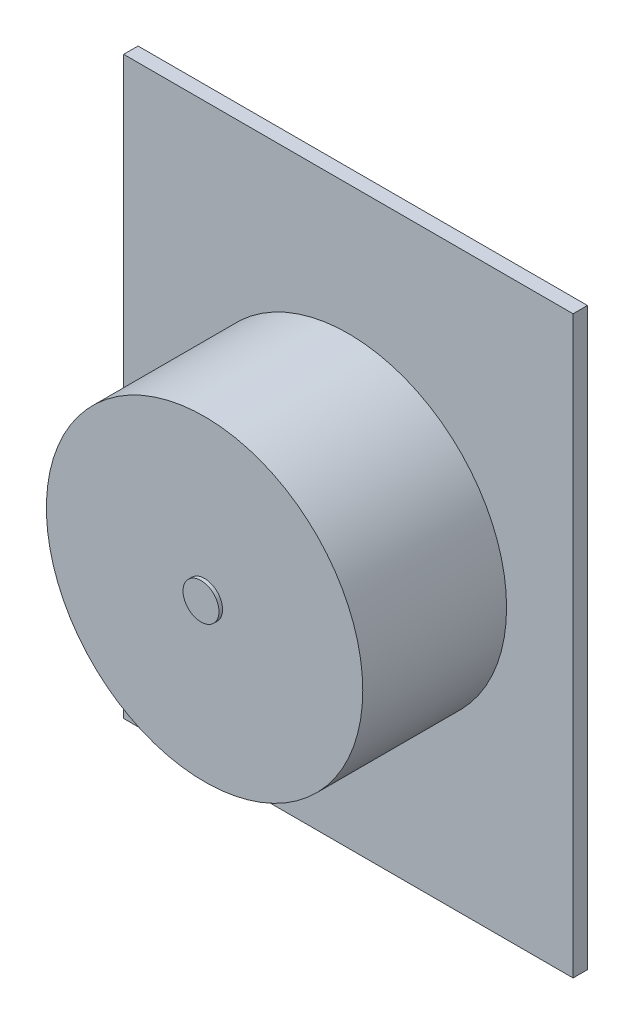
ISO-10303-21;
HEADER;
FILE_DESCRIPTION(('STEP AP214'),'2;1');
FILE_NAME('part.step','',(''),(''),'','','');
FILE_SCHEMA(('AUTOMOTIVE_DESIGN { 1 0 10303 214 1 1 1 1 }'));
ENDSEC;
DATA;
#1=APPLICATION_CONTEXT('core data for automotive mechanical design processes');
#2=APPLICATION_PROTOCOL_DEFINITION('international standard','automotive_design',2000,#1);
#3=PRODUCT_CONTEXT('',#1,'mechanical');
#4=PRODUCT('Part','Part','',(#3));
#5=PRODUCT_RELATED_PRODUCT_CATEGORY('part','',(#4));
#6=PRODUCT_DEFINITION_FORMATION('','',#4);
#7=PRODUCT_DEFINITION_CONTEXT('part definition',#1,'design');
#8=PRODUCT_DEFINITION('design','',#6,#7);
#9=PRODUCT_DEFINITION_SHAPE('','',#8);
#10=(LENGTH_UNIT() NAMED_UNIT(*) SI_UNIT(.MILLI.,.METRE.));
#11=(NAMED_UNIT(*) PLANE_ANGLE_UNIT() SI_UNIT($,.RADIAN.));
#12=(NAMED_UNIT(*) SI_UNIT($,.STERADIAN.) SOLID_ANGLE_UNIT());
#13=UNCERTAINTY_MEASURE_WITH_UNIT(LENGTH_MEASURE(1.E-05),#10,'distance_accuracy_value','');
#14=(GEOMETRIC_REPRESENTATION_CONTEXT(3) GLOBAL_UNCERTAINTY_ASSIGNED_CONTEXT((#13)) GLOBAL_UNIT_ASSIGNED_CONTEXT((#10,
#11,#12)) REPRESENTATION_CONTEXT('',''));
#15=CARTESIAN_POINT('',(0.,0.,0.));
#16=DIRECTION('',(0.,0.,1.));
#17=DIRECTION('',(1.,0.,0.));
#18=AXIS2_PLACEMENT_3D('',#15,#16,#17);
#19=CARTESIAN_POINT('',(0.,0.,40.));
#20=DIRECTION('',(-1.,0.,0.));
#21=DIRECTION('',(0.,-1.,0.));
#22=AXIS2_PLACEMENT_3D('',#19,#20,#21);
#23=PLANE('',#22);
#24=DIRECTION('',(0.,1.,0.));
#25=VECTOR('',#24,1.);
#26=CARTESIAN_POINT('',(0.,0.,0.));
#27=LINE('',#26,#25);
#28=CARTESIAN_POINT('',(0.,0.,0.));
#29=VERTEX_POINT('',#28);
#30=CARTESIAN_POINT('',(0.,1600.,0.));
#31=VERTEX_POINT('',#30);
#32=EDGE_CURVE('E106',#29,#31,#27,.T.);
#33=ORIENTED_EDGE('',*,*,#32,.T.);
#34=DIRECTION('',(0.,0.,-1.));
#35=VECTOR('',#34,1.);
#36=CARTESIAN_POINT('',(0.,1600.,40.));
#37=LINE('',#36,#35);
#38=CARTESIAN_POINT('',(0.,1600.,40.));
#39=VERTEX_POINT('',#38);
#40=EDGE_CURVE('E45',#39,#31,#37,.T.);
#41=ORIENTED_EDGE('',*,*,#40,.F.);
#42=DIRECTION('',(0.,1.,0.));
#43=VECTOR('',#42,1.);
#44=CARTESIAN_POINT('',(0.,0.,40.));
#45=LINE('',#44,#43);
#46=CARTESIAN_POINT('',(0.,0.,40.));
#47=VERTEX_POINT('',#46);
#48=EDGE_CURVE('E91',#47,#39,#45,.T.);
#49=ORIENTED_EDGE('',*,*,#48,.F.);
#50=DIRECTION('',(0.,0.,-1.));
#51=VECTOR('',#50,1.);
#52=CARTESIAN_POINT('',(0.,0.,40.));
#53=LINE('',#52,#51);
#54=EDGE_CURVE('E105',#47,#29,#53,.T.);
#55=ORIENTED_EDGE('',*,*,#54,.T.);
#56=EDGE_LOOP('',(#33,#41,#49,#55));
#57=FACE_BOUND('',#56,.T.);
#58=ADVANCED_FACE('F39',(#57),#23,.F.);
#59=CARTESIAN_POINT('',(0.,1600.,40.));
#60=DIRECTION('',(0.,-1.,0.));
#61=DIRECTION('',(1.,0.,0.));
#62=AXIS2_PLACEMENT_3D('',#59,#60,#61);
#63=PLANE('',#62);
#64=DIRECTION('',(-1.,0.,0.));
#65=VECTOR('',#64,1.);
#66=CARTESIAN_POINT('',(0.,1600.,0.));
#67=LINE('',#66,#65);
#68=CARTESIAN_POINT('',(-1250.,1600.,0.));
#69=VERTEX_POINT('',#68);
#70=EDGE_CURVE('E98',#31,#69,#67,.T.);
#71=ORIENTED_EDGE('',*,*,#70,.T.);
#72=DIRECTION('',(0.,0.,-1.));
#73=VECTOR('',#72,1.);
#74=CARTESIAN_POINT('',(-1250.,1600.,40.));
#75=LINE('',#74,#73);
#76=CARTESIAN_POINT('',(-1250.,1600.,40.));
#77=VERTEX_POINT('',#76);
#78=EDGE_CURVE('E96',#77,#69,#75,.T.);
#79=ORIENTED_EDGE('',*,*,#78,.F.);
#80=DIRECTION('',(-1.,0.,0.));
#81=VECTOR('',#80,1.);
#82=CARTESIAN_POINT('',(0.,1600.,40.));
#83=LINE('',#82,#81);
#84=EDGE_CURVE('E86',#39,#77,#83,.T.);
#85=ORIENTED_EDGE('',*,*,#84,.F.);
#86=ORIENTED_EDGE('',*,*,#40,.T.);
#87=EDGE_LOOP('',(#71,#79,#85,#86));
#88=FACE_BOUND('',#87,.T.);
#89=ADVANCED_FACE('F100',(#88),#63,.F.);
#90=CARTESIAN_POINT('',(-1250.,0.,40.));
#91=DIRECTION('',(1.,0.,0.));
#92=DIRECTION('',(0.,0.,-1.));
#93=AXIS2_PLACEMENT_3D('',#90,#91,#92);
#94=PLANE('',#93);
#95=DIRECTION('',(0.,-1.,0.));
#96=VECTOR('',#95,1.);
#97=CARTESIAN_POINT('',(-1250.,0.,0.));
#98=LINE('',#97,#96);
#99=CARTESIAN_POINT('',(-1250.,0.,0.));
#100=VERTEX_POINT('',#99);
#101=EDGE_CURVE('E74',#69,#100,#98,.T.);
#102=ORIENTED_EDGE('',*,*,#101,.T.);
#103=DIRECTION('',(0.,0.,-1.));
#104=VECTOR('',#103,1.);
#105=CARTESIAN_POINT('',(-1250.,0.,40.));
#106=LINE('',#105,#104);
#107=CARTESIAN_POINT('',(-1250.,0.,40.));
#108=VERTEX_POINT('',#107);
#109=EDGE_CURVE('E97',#108,#100,#106,.T.);
#110=ORIENTED_EDGE('',*,*,#109,.F.);
#111=DIRECTION('',(0.,-1.,0.));
#112=VECTOR('',#111,1.);
#113=CARTESIAN_POINT('',(-1250.,0.,40.));
#114=LINE('',#113,#112);
#115=EDGE_CURVE('E93',#77,#108,#114,.T.);
#116=ORIENTED_EDGE('',*,*,#115,.F.);
#117=ORIENTED_EDGE('',*,*,#78,.T.);
#118=EDGE_LOOP('',(#102,#110,#116,#117));
#119=FACE_BOUND('',#118,.T.);
#120=ADVANCED_FACE('F99',(#119),#94,.F.);
#121=CARTESIAN_POINT('',(0.,0.,40.));
#122=DIRECTION('',(0.,1.,0.));
#123=DIRECTION('',(0.,0.,1.));
#124=AXIS2_PLACEMENT_3D('',#121,#122,#123);
#125=PLANE('',#124);
#126=DIRECTION('',(1.,0.,0.));
#127=VECTOR('',#126,1.);
#128=CARTESIAN_POINT('',(0.,0.,0.));
#129=LINE('',#128,#127);
#130=EDGE_CURVE('E78',#100,#29,#129,.T.);
#131=ORIENTED_EDGE('',*,*,#130,.T.);
#132=ORIENTED_EDGE('',*,*,#54,.F.);
#133=DIRECTION('',(1.,0.,0.));
#134=VECTOR('',#133,1.);
#135=CARTESIAN_POINT('',(0.,0.,40.));
#136=LINE('',#135,#134);
#137=EDGE_CURVE('E60',#108,#47,#136,.T.);
#138=ORIENTED_EDGE('',*,*,#137,.F.);
#139=ORIENTED_EDGE('',*,*,#109,.T.);
#140=EDGE_LOOP('',(#131,#132,#138,#139));
#141=FACE_BOUND('',#140,.T.);
#142=ADVANCED_FACE('F111',(#141),#125,.F.);
#143=CARTESIAN_POINT('',(0.,0.,40.));
#144=DIRECTION('',(0.,0.,1.));
#145=DIRECTION('',(1.,0.,0.));
#146=AXIS2_PLACEMENT_3D('',#143,#144,#145);
#147=PLANE('',#146);
#148=CARTESIAN_POINT('',(-625.,800.,40.));
#149=DIRECTION('',(0.,0.,1.));
#150=DIRECTION('',(1.,0.,0.));
#151=AXIS2_PLACEMENT_3D('',#148,#149,#150);
#152=CIRCLE('',#151,440.);
#153=CARTESIAN_POINT('',(-185.,800.,40.));
#154=VERTEX_POINT('',#153);
#155=EDGE_CURVE('E48',#154,#154,#152,.T.);
#156=ORIENTED_EDGE('',*,*,#155,.F.);
#157=EDGE_LOOP('',(#156));
#158=FACE_BOUND('',#157,.T.);
#159=ORIENTED_EDGE('',*,*,#48,.T.);
#160=ORIENTED_EDGE('',*,*,#84,.T.);
#161=ORIENTED_EDGE('',*,*,#115,.T.);
#162=ORIENTED_EDGE('',*,*,#137,.T.);
#163=EDGE_LOOP('',(#159,#160,#161,#162));
#164=FACE_BOUND('',#163,.T.);
#165=ADVANCED_FACE('F90',(#158,#164),#147,.T.);
#166=CARTESIAN_POINT('',(0.,0.,0.));
#167=DIRECTION('',(0.,0.,1.));
#168=DIRECTION('',(1.,0.,0.));
#169=AXIS2_PLACEMENT_3D('',#166,#167,#168);
#170=PLANE('',#169);
#171=ORIENTED_EDGE('',*,*,#32,.F.);
#172=ORIENTED_EDGE('',*,*,#130,.F.);
#173=ORIENTED_EDGE('',*,*,#101,.F.);
#174=ORIENTED_EDGE('',*,*,#70,.F.);
#175=EDGE_LOOP('',(#171,#172,#173,#174));
#176=FACE_BOUND('',#175,.T.);
#177=ADVANCED_FACE('F120',(#176),#170,.F.);
#178=CARTESIAN_POINT('',(-625.,800.,440.));
#179=DIRECTION('',(0.,0.,-1.));
#180=DIRECTION('',(-1.,0.,0.));
#181=AXIS2_PLACEMENT_3D('',#178,#179,#180);
#182=CYLINDRICAL_SURFACE('',#181,440.);
#183=CARTESIAN_POINT('',(-625.,800.,440.));
#184=DIRECTION('',(0.,0.,1.));
#185=DIRECTION('',(1.,0.,0.));
#186=AXIS2_PLACEMENT_3D('',#183,#184,#185);
#187=CIRCLE('',#186,440.);
#188=CARTESIAN_POINT('',(-185.,800.,440.));
#189=VERTEX_POINT('',#188);
#190=EDGE_CURVE('E108',#189,#189,#187,.T.);
#191=ORIENTED_EDGE('',*,*,#190,.F.);
#192=EDGE_LOOP('',(#191));
#193=FACE_BOUND('',#192,.T.);
#194=ORIENTED_EDGE('',*,*,#155,.T.);
#195=EDGE_LOOP('',(#194));
#196=FACE_BOUND('',#195,.T.);
#197=ADVANCED_FACE('F140',(#193,#196),#182,.T.);
#198=CARTESIAN_POINT('',(-625.,800.,440.));
#199=DIRECTION('',(0.,0.,1.));
#200=DIRECTION('',(1.,0.,0.));
#201=AXIS2_PLACEMENT_3D('',#198,#199,#200);
#202=PLANE('',#201);
#203=CARTESIAN_POINT('',(-625.,800.,440.));
#204=DIRECTION('',(0.,0.,1.));
#205=DIRECTION('',(1.,0.,0.));
#206=AXIS2_PLACEMENT_3D('',#203,#204,#205);
#207=CIRCLE('',#206,50.);
#208=CARTESIAN_POINT('',(-575.,800.,440.));
#209=VERTEX_POINT('',#208);
#210=EDGE_CURVE('E11',#209,#209,#207,.T.);
#211=ORIENTED_EDGE('',*,*,#210,.F.);
#212=EDGE_LOOP('',(#211));
#213=FACE_BOUND('',#212,.T.);
#214=ORIENTED_EDGE('',*,*,#190,.T.);
#215=EDGE_LOOP('',(#214));
#216=FACE_BOUND('',#215,.T.);
#217=ADVANCED_FACE('F134',(#213,#216),#202,.T.);
#218=CARTESIAN_POINT('',(-625.,800.,450.));
#219=DIRECTION('',(0.,0.,-1.));
#220=DIRECTION('',(-1.,0.,0.));
#221=AXIS2_PLACEMENT_3D('',#218,#219,#220);
#222=CYLINDRICAL_SURFACE('',#221,50.);
#223=CARTESIAN_POINT('',(-625.,800.,450.));
#224=DIRECTION('',(0.,0.,1.));
#225=DIRECTION('',(1.,0.,0.));
#226=AXIS2_PLACEMENT_3D('',#223,#224,#225);
#227=CIRCLE('',#226,50.);
#228=CARTESIAN_POINT('',(-575.,800.,450.));
#229=VERTEX_POINT('',#228);
#230=EDGE_CURVE('E122',#229,#229,#227,.T.);
#231=ORIENTED_EDGE('',*,*,#230,.F.);
#232=EDGE_LOOP('',(#231));
#233=FACE_BOUND('',#232,.T.);
#234=ORIENTED_EDGE('',*,*,#210,.T.);
#235=EDGE_LOOP('',(#234));
#236=FACE_BOUND('',#235,.T.);
#237=ADVANCED_FACE('F128',(#233,#236),#222,.T.);
#238=CARTESIAN_POINT('',(-625.,800.,450.));
#239=DIRECTION('',(0.,0.,1.));
#240=DIRECTION('',(1.,0.,0.));
#241=AXIS2_PLACEMENT_3D('',#238,#239,#240);
#242=PLANE('',#241);
#243=ORIENTED_EDGE('',*,*,#230,.T.);
#244=EDGE_LOOP('',(#243));
#245=FACE_BOUND('',#244,.T.);
#246=ADVANCED_FACE('F126',(#245),#242,.T.);
#247=CLOSED_SHELL('',(#58,#89,#120,#142,#165,#177,#197,#217,#237,#246));
#248=MANIFOLD_SOLID_BREP('B2',#247);
#249=ADVANCED_BREP_SHAPE_REPRESENTATION('',(#18,#248),#14);
#250=SHAPE_DEFINITION_REPRESENTATION(#9,#249);
ENDSEC;
END-ISO-10303-21;
